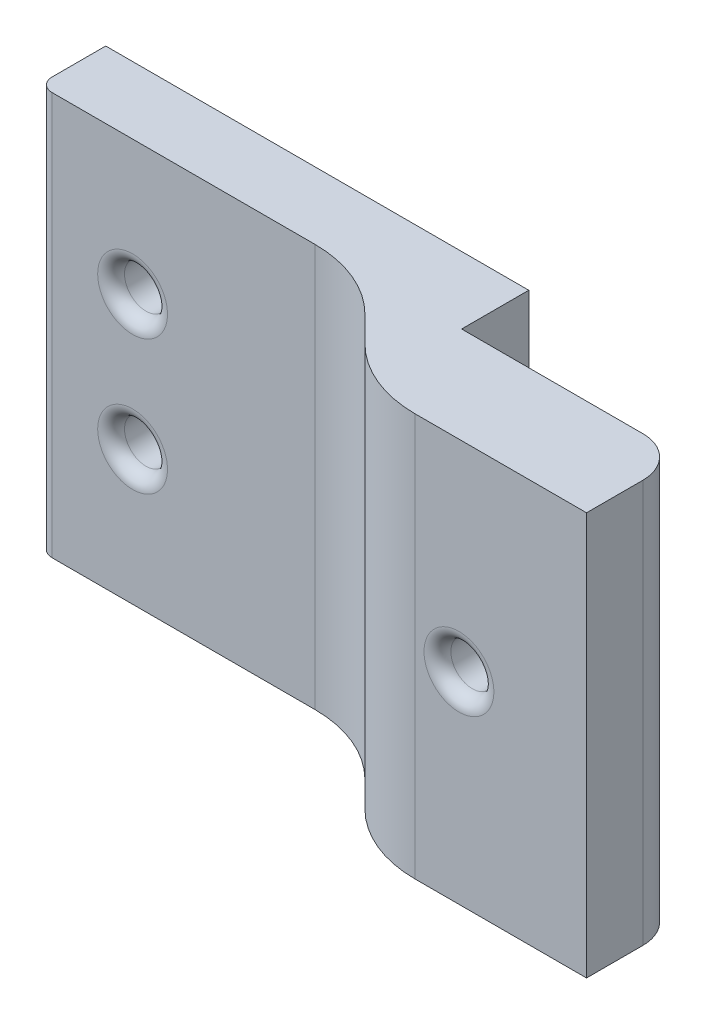
ISO-10303-21;
HEADER;
FILE_DESCRIPTION(('STEP AP214'),'2;1');
FILE_NAME('part.step','',(''),(''),'','','');
FILE_SCHEMA(('AUTOMOTIVE_DESIGN { 1 0 10303 214 1 1 1 1 }'));
ENDSEC;
DATA;
#1=APPLICATION_CONTEXT('core data for automotive mechanical design processes');
#2=APPLICATION_PROTOCOL_DEFINITION('international standard','automotive_design',2000,#1);
#3=PRODUCT_CONTEXT('',#1,'mechanical');
#4=PRODUCT('Part','Part','',(#3));
#5=PRODUCT_RELATED_PRODUCT_CATEGORY('part','',(#4));
#6=PRODUCT_DEFINITION_FORMATION('','',#4);
#7=PRODUCT_DEFINITION_CONTEXT('part definition',#1,'design');
#8=PRODUCT_DEFINITION('design','',#6,#7);
#9=PRODUCT_DEFINITION_SHAPE('','',#8);
#10=(LENGTH_UNIT() NAMED_UNIT(*) SI_UNIT(.MILLI.,.METRE.));
#11=(NAMED_UNIT(*) PLANE_ANGLE_UNIT() SI_UNIT($,.RADIAN.));
#12=(NAMED_UNIT(*) SI_UNIT($,.STERADIAN.) SOLID_ANGLE_UNIT());
#13=UNCERTAINTY_MEASURE_WITH_UNIT(LENGTH_MEASURE(1.E-05),#10,'distance_accuracy_value','');
#14=(GEOMETRIC_REPRESENTATION_CONTEXT(3) GLOBAL_UNCERTAINTY_ASSIGNED_CONTEXT((#13)) GLOBAL_UNIT_ASSIGNED_CONTEXT((#10,
#11,#12)) REPRESENTATION_CONTEXT('',''));
#15=CARTESIAN_POINT('',(0.,0.,0.));
#16=DIRECTION('',(0.,0.,1.));
#17=DIRECTION('',(1.,0.,0.));
#18=AXIS2_PLACEMENT_3D('',#15,#16,#17);
#19=CARTESIAN_POINT('',(10.6210039239997,30.,1.89238691569627));
#20=DIRECTION('',(-1.,0.,0.));
#21=DIRECTION('',(0.,0.,1.));
#22=AXIS2_PLACEMENT_3D('',#19,#20,#21);
#23=PLANE('',#22);
#24=DIRECTION('',(0.,0.,-1.));
#25=VECTOR('',#24,1.);
#26=CARTESIAN_POINT('',(10.6210039239997,0.,1.89238691569627));
#27=LINE('',#26,#25);
#28=CARTESIAN_POINT('',(10.6210039239997,0.,9.09238691569627));
#29=VERTEX_POINT('',#28);
#30=CARTESIAN_POINT('',(10.6210039239997,0.,4.89238691569627));
#31=VERTEX_POINT('',#30);
#32=EDGE_CURVE('E163',#29,#31,#27,.T.);
#33=ORIENTED_EDGE('',*,*,#32,.T.);
#34=DIRECTION('',(0.,-1.,0.));
#35=VECTOR('',#34,1.);
#36=CARTESIAN_POINT('',(10.6210039239997,30.,4.89238691569627));
#37=LINE('',#36,#35);
#38=CARTESIAN_POINT('',(10.6210039239997,30.,4.89238691569627));
#39=VERTEX_POINT('',#38);
#40=EDGE_CURVE('E225',#31,#39,#37,.F.);
#41=ORIENTED_EDGE('',*,*,#40,.T.);
#42=DIRECTION('',(0.,0.,-1.));
#43=VECTOR('',#42,1.);
#44=CARTESIAN_POINT('',(10.6210039239997,30.,1.89238691569627));
#45=LINE('',#44,#43);
#46=CARTESIAN_POINT('',(10.6210039239997,30.,9.09238691569627));
#47=VERTEX_POINT('',#46);
#48=EDGE_CURVE('E133',#47,#39,#45,.T.);
#49=ORIENTED_EDGE('',*,*,#48,.F.);
#50=DIRECTION('',(0.,-1.,0.));
#51=VECTOR('',#50,1.);
#52=CARTESIAN_POINT('',(10.6210039239997,30.,9.09238691569627));
#53=LINE('',#52,#51);
#54=EDGE_CURVE('E162',#47,#29,#53,.T.);
#55=ORIENTED_EDGE('',*,*,#54,.T.);
#56=EDGE_LOOP('',(#33,#41,#49,#55));
#57=FACE_BOUND('',#56,.T.);
#58=ADVANCED_FACE('F33',(#57),#23,.F.);
#59=CARTESIAN_POINT('',(-5.87899607600026,30.,1.89238691569627));
#60=DIRECTION('',(0.,0.,1.));
#61=DIRECTION('',(1.,0.,0.));
#62=AXIS2_PLACEMENT_3D('',#59,#60,#61);
#63=PLANE('',#62);
#64=CARTESIAN_POINT('',(1.12100392399974,15.,1.89238691569627));
#65=DIRECTION('',(0.,0.,1.));
#66=DIRECTION('',(1.,0.,0.));
#67=AXIS2_PLACEMENT_3D('',#64,#65,#66);
#68=CIRCLE('',#67,2.6);
#69=CARTESIAN_POINT('',(3.72100392399974,15.,1.89238691569627));
#70=VERTEX_POINT('',#69);
#71=EDGE_CURVE('E215',#70,#70,#68,.T.);
#72=ORIENTED_EDGE('',*,*,#71,.T.);
#73=EDGE_LOOP('',(#72));
#74=FACE_BOUND('',#73,.T.);
#75=DIRECTION('',(-1.,0.,0.));
#76=VECTOR('',#75,1.);
#77=CARTESIAN_POINT('',(-5.87899607600026,30.,1.89238691569627));
#78=LINE('',#77,#76);
#79=CARTESIAN_POINT('',(7.62100392399974,30.,1.89238691569627));
#80=VERTEX_POINT('',#79);
#81=CARTESIAN_POINT('',(-5.87899607600026,30.,1.89238691569627));
#82=VERTEX_POINT('',#81);
#83=EDGE_CURVE('E121',#80,#82,#78,.T.);
#84=ORIENTED_EDGE('',*,*,#83,.F.);
#85=DIRECTION('',(0.,-1.,0.));
#86=VECTOR('',#85,1.);
#87=CARTESIAN_POINT('',(7.62100392399974,30.,1.89238691569627));
#88=LINE('',#87,#86);
#89=CARTESIAN_POINT('',(7.62100392399974,0.,1.89238691569627));
#90=VERTEX_POINT('',#89);
#91=EDGE_CURVE('E221',#80,#90,#88,.T.);
#92=ORIENTED_EDGE('',*,*,#91,.T.);
#93=DIRECTION('',(-1.,0.,0.));
#94=VECTOR('',#93,1.);
#95=CARTESIAN_POINT('',(-5.87899607600026,0.,1.89238691569627));
#96=LINE('',#95,#94);
#97=CARTESIAN_POINT('',(-5.87899607600026,0.,1.89238691569627));
#98=VERTEX_POINT('',#97);
#99=EDGE_CURVE('E139',#90,#98,#96,.T.);
#100=ORIENTED_EDGE('',*,*,#99,.T.);
#101=DIRECTION('',(0.,-1.,0.));
#102=VECTOR('',#101,1.);
#103=CARTESIAN_POINT('',(-5.87899607600026,30.,1.89238691569627));
#104=LINE('',#103,#102);
#105=EDGE_CURVE('E136',#82,#98,#104,.T.);
#106=ORIENTED_EDGE('',*,*,#105,.F.);
#107=EDGE_LOOP('',(#84,#92,#100,#106));
#108=FACE_BOUND('',#107,.T.);
#109=ADVANCED_FACE('F137',(#74,#108),#63,.F.);
#110=CARTESIAN_POINT('',(-5.87899607600026,30.,-3.10761308430373));
#111=DIRECTION('',(-1.,0.,0.));
#112=DIRECTION('',(0.,0.,1.));
#113=AXIS2_PLACEMENT_3D('',#110,#111,#112);
#114=PLANE('',#113);
#115=DIRECTION('',(0.,0.,-1.));
#116=VECTOR('',#115,1.);
#117=CARTESIAN_POINT('',(-5.87899607600026,0.,-3.10761308430373));
#118=LINE('',#117,#116);
#119=CARTESIAN_POINT('',(-5.87899607600026,0.,-3.10761308430373));
#120=VERTEX_POINT('',#119);
#121=EDGE_CURVE('E167',#98,#120,#118,.T.);
#122=ORIENTED_EDGE('',*,*,#121,.T.);
#123=DIRECTION('',(0.,-1.,0.));
#124=VECTOR('',#123,1.);
#125=CARTESIAN_POINT('',(-5.87899607600026,30.,-3.10761308430373));
#126=LINE('',#125,#124);
#127=CARTESIAN_POINT('',(-5.87899607600026,30.,-3.10761308430373));
#128=VERTEX_POINT('',#127);
#129=EDGE_CURVE('E143',#128,#120,#126,.T.);
#130=ORIENTED_EDGE('',*,*,#129,.F.);
#131=DIRECTION('',(0.,0.,-1.));
#132=VECTOR('',#131,1.);
#133=CARTESIAN_POINT('',(-5.87899607600026,30.,-3.10761308430373));
#134=LINE('',#133,#132);
#135=EDGE_CURVE('E125',#82,#128,#134,.T.);
#136=ORIENTED_EDGE('',*,*,#135,.F.);
#137=ORIENTED_EDGE('',*,*,#105,.T.);
#138=EDGE_LOOP('',(#122,#130,#136,#137));
#139=FACE_BOUND('',#138,.T.);
#140=ADVANCED_FACE('F145',(#139),#114,.F.);
#141=CARTESIAN_POINT('',(-5.87899607600026,30.,-3.10761308430373));
#142=DIRECTION('',(0.,0.,1.));
#143=DIRECTION('',(1.,0.,0.));
#144=AXIS2_PLACEMENT_3D('',#141,#142,#143);
#145=PLANE('',#144);
#146=CARTESIAN_POINT('',(-30.3789960760003,10.,-3.10761308430373));
#147=DIRECTION('',(0.,0.,1.));
#148=DIRECTION('',(1.,0.,0.));
#149=AXIS2_PLACEMENT_3D('',#146,#147,#148);
#150=CIRCLE('',#149,2.6);
#151=CARTESIAN_POINT('',(-27.7789960760003,10.,-3.10761308430373));
#152=VERTEX_POINT('',#151);
#153=EDGE_CURVE('E200',#152,#152,#150,.T.);
#154=ORIENTED_EDGE('',*,*,#153,.T.);
#155=EDGE_LOOP('',(#154));
#156=FACE_BOUND('',#155,.T.);
#157=CARTESIAN_POINT('',(-30.3789960760003,20.,-3.10761308430373));
#158=DIRECTION('',(0.,0.,1.));
#159=DIRECTION('',(1.,0.,0.));
#160=AXIS2_PLACEMENT_3D('',#157,#158,#159);
#161=CIRCLE('',#160,2.6);
#162=CARTESIAN_POINT('',(-27.7789960760003,20.,-3.10761308430373));
#163=VERTEX_POINT('',#162);
#164=EDGE_CURVE('E197',#163,#163,#161,.T.);
#165=ORIENTED_EDGE('',*,*,#164,.T.);
#166=EDGE_LOOP('',(#165));
#167=FACE_BOUND('',#166,.T.);
#168=DIRECTION('',(-1.,0.,0.));
#169=VECTOR('',#168,1.);
#170=CARTESIAN_POINT('',(-5.87899607600026,0.,-3.10761308430373));
#171=LINE('',#170,#169);
#172=CARTESIAN_POINT('',(-37.3789960760003,0.,-3.10761308430373));
#173=VERTEX_POINT('',#172);
#174=EDGE_CURVE('E169',#120,#173,#171,.T.);
#175=ORIENTED_EDGE('',*,*,#174,.T.);
#176=DIRECTION('',(0.,-1.,0.));
#177=VECTOR('',#176,1.);
#178=CARTESIAN_POINT('',(-37.3789960760003,30.,-3.10761308430373));
#179=LINE('',#178,#177);
#180=CARTESIAN_POINT('',(-37.3789960760003,30.,-3.10761308430373));
#181=VERTEX_POINT('',#180);
#182=EDGE_CURVE('E182',#181,#173,#179,.T.);
#183=ORIENTED_EDGE('',*,*,#182,.F.);
#184=DIRECTION('',(-1.,0.,0.));
#185=VECTOR('',#184,1.);
#186=CARTESIAN_POINT('',(-5.87899607600026,30.,-3.10761308430373));
#187=LINE('',#186,#185);
#188=EDGE_CURVE('E148',#128,#181,#187,.T.);
#189=ORIENTED_EDGE('',*,*,#188,.F.);
#190=ORIENTED_EDGE('',*,*,#129,.T.);
#191=EDGE_LOOP('',(#175,#183,#189,#190));
#192=FACE_BOUND('',#191,.T.);
#193=ADVANCED_FACE('F285',(#156,#167,#192),#145,.F.);
#194=CARTESIAN_POINT('',(-37.3789960760003,30.,1.89238691569627));
#195=DIRECTION('',(1.,0.,0.));
#196=DIRECTION('',(0.,0.,-1.));
#197=AXIS2_PLACEMENT_3D('',#194,#195,#196);
#198=PLANE('',#197);
#199=DIRECTION('',(0.,0.,1.));
#200=VECTOR('',#199,1.);
#201=CARTESIAN_POINT('',(-37.3789960760003,0.,1.89238691569627));
#202=LINE('',#201,#200);
#203=CARTESIAN_POINT('',(-37.3789960760003,0.,0.892386915696272));
#204=VERTEX_POINT('',#203);
#205=EDGE_CURVE('E171',#173,#204,#202,.T.);
#206=ORIENTED_EDGE('',*,*,#205,.T.);
#207=DIRECTION('',(0.,-1.,0.));
#208=VECTOR('',#207,1.);
#209=CARTESIAN_POINT('',(-37.3789960760003,30.,0.892386915696272));
#210=LINE('',#209,#208);
#211=CARTESIAN_POINT('',(-37.3789960760003,30.,0.892386915696272));
#212=VERTEX_POINT('',#211);
#213=EDGE_CURVE('E41',#204,#212,#210,.F.);
#214=ORIENTED_EDGE('',*,*,#213,.T.);
#215=DIRECTION('',(0.,0.,1.));
#216=VECTOR('',#215,1.);
#217=CARTESIAN_POINT('',(-37.3789960760003,30.,1.89238691569627));
#218=LINE('',#217,#216);
#219=EDGE_CURVE('E150',#181,#212,#218,.T.);
#220=ORIENTED_EDGE('',*,*,#219,.F.);
#221=ORIENTED_EDGE('',*,*,#182,.T.);
#222=EDGE_LOOP('',(#206,#214,#220,#221));
#223=FACE_BOUND('',#222,.T.);
#224=ADVANCED_FACE('F343',(#223),#198,.F.);
#225=CARTESIAN_POINT('',(-37.3789960760003,30.,1.89238691569627));
#226=DIRECTION('',(0.,0.,-1.));
#227=DIRECTION('',(-1.,0.,0.));
#228=AXIS2_PLACEMENT_3D('',#225,#226,#227);
#229=PLANE('',#228);
#230=CARTESIAN_POINT('',(-30.3789960760003,10.,1.89238691569627));
#231=DIRECTION('',(0.,0.,-1.));
#232=DIRECTION('',(-1.,0.,0.));
#233=AXIS2_PLACEMENT_3D('',#230,#231,#232);
#234=CIRCLE('',#233,2.6);
#235=CARTESIAN_POINT('',(-32.9789960760003,10.,1.89238691569627));
#236=VERTEX_POINT('',#235);
#237=EDGE_CURVE('E194',#236,#236,#234,.T.);
#238=ORIENTED_EDGE('',*,*,#237,.T.);
#239=EDGE_LOOP('',(#238));
#240=FACE_BOUND('',#239,.T.);
#241=CARTESIAN_POINT('',(-30.3789960760003,20.,1.89238691569627));
#242=DIRECTION('',(0.,0.,-1.));
#243=DIRECTION('',(-1.,0.,0.));
#244=AXIS2_PLACEMENT_3D('',#241,#242,#243);
#245=CIRCLE('',#244,2.6);
#246=CARTESIAN_POINT('',(-32.9789960760003,20.,1.89238691569627));
#247=VERTEX_POINT('',#246);
#248=EDGE_CURVE('E191',#247,#247,#245,.T.);
#249=ORIENTED_EDGE('',*,*,#248,.T.);
#250=EDGE_LOOP('',(#249));
#251=FACE_BOUND('',#250,.T.);
#252=DIRECTION('',(1.,0.,0.));
#253=VECTOR('',#252,1.);
#254=CARTESIAN_POINT('',(-37.3789960760003,30.,1.89238691569627));
#255=LINE('',#254,#253);
#256=CARTESIAN_POINT('',(-36.3789960760003,30.,1.89238691569627));
#257=VERTEX_POINT('',#256);
#258=CARTESIAN_POINT('',(-16.8069181373582,30.,1.89238691569627));
#259=VERTEX_POINT('',#258);
#260=EDGE_CURVE('E155',#257,#259,#255,.T.);
#261=ORIENTED_EDGE('',*,*,#260,.F.);
#262=DIRECTION('',(0.,-1.,0.));
#263=VECTOR('',#262,1.);
#264=CARTESIAN_POINT('',(-36.3789960760003,30.,1.89238691569627));
#265=LINE('',#264,#263);
#266=CARTESIAN_POINT('',(-36.3789960760003,0.,1.89238691569627));
#267=VERTEX_POINT('',#266);
#268=EDGE_CURVE('E248',#257,#267,#265,.T.);
#269=ORIENTED_EDGE('',*,*,#268,.T.);
#270=DIRECTION('',(1.,0.,0.));
#271=VECTOR('',#270,1.);
#272=CARTESIAN_POINT('',(-37.3789960760003,0.,1.89238691569627));
#273=LINE('',#272,#271);
#274=CARTESIAN_POINT('',(-16.8069181373582,0.,1.89238691569627));
#275=VERTEX_POINT('',#274);
#276=EDGE_CURVE('E173',#267,#275,#273,.T.);
#277=ORIENTED_EDGE('',*,*,#276,.T.);
#278=DIRECTION('',(0.,-1.,0.));
#279=VECTOR('',#278,1.);
#280=CARTESIAN_POINT('',(-16.8069181373582,30.,1.89238691569627));
#281=LINE('',#280,#279);
#282=EDGE_CURVE('E233',#275,#259,#281,.F.);
#283=ORIENTED_EDGE('',*,*,#282,.T.);
#284=EDGE_LOOP('',(#261,#269,#277,#283));
#285=FACE_BOUND('',#284,.T.);
#286=ADVANCED_FACE('F254',(#240,#251,#285),#229,.F.);
#287=CARTESIAN_POINT('',(-5.87899607600026,30.,9.09238691569627));
#288=DIRECTION('',(0.707106781186544,0.,-0.707106781186551));
#289=DIRECTION('',(-0.707106781186551,0.,-0.707106781186544));
#290=AXIS2_PLACEMENT_3D('',#287,#288,#289);
#291=PLANE('',#290);
#292=DIRECTION('',(0.707106781186551,0.,0.707106781186544));
#293=VECTOR('',#292,1.);
#294=CARTESIAN_POINT('',(-5.87899607600026,30.,9.09238691569627));
#295=LINE('',#294,#293);
#296=CARTESIAN_POINT('',(-10.4429571066793,30.,4.52842588501731));
#297=VERTEX_POINT('',#296);
#298=CARTESIAN_POINT('',(-8.51503504532132,30.,6.45634794637523));
#299=VERTEX_POINT('',#298);
#300=EDGE_CURVE('E157',#297,#299,#295,.T.);
#301=ORIENTED_EDGE('',*,*,#300,.F.);
#302=DIRECTION('',(0.,-1.,0.));
#303=VECTOR('',#302,1.);
#304=CARTESIAN_POINT('',(-10.4429571066793,0.,4.52842588501731));
#305=LINE('',#304,#303);
#306=CARTESIAN_POINT('',(-10.4429571066793,0.,4.52842588501731));
#307=VERTEX_POINT('',#306);
#308=EDGE_CURVE('E230',#297,#307,#305,.T.);
#309=ORIENTED_EDGE('',*,*,#308,.T.);
#310=DIRECTION('',(0.707106781186551,0.,0.707106781186544));
#311=VECTOR('',#310,1.);
#312=CARTESIAN_POINT('',(-5.87899607600026,0.,9.09238691569627));
#313=LINE('',#312,#311);
#314=CARTESIAN_POINT('',(-8.51503504532132,0.,6.45634794637523));
#315=VERTEX_POINT('',#314);
#316=EDGE_CURVE('E175',#307,#315,#313,.T.);
#317=ORIENTED_EDGE('',*,*,#316,.T.);
#318=DIRECTION('',(0.,-1.,0.));
#319=VECTOR('',#318,1.);
#320=CARTESIAN_POINT('',(-8.51503504532132,30.,6.45634794637523));
#321=LINE('',#320,#319);
#322=EDGE_CURVE('E228',#315,#299,#321,.F.);
#323=ORIENTED_EDGE('',*,*,#322,.T.);
#324=EDGE_LOOP('',(#301,#309,#317,#323));
#325=FACE_BOUND('',#324,.T.);
#326=ADVANCED_FACE('F267',(#325),#291,.F.);
#327=CARTESIAN_POINT('',(-5.87899607600026,30.,9.09238691569627));
#328=DIRECTION('',(0.,0.,-1.));
#329=DIRECTION('',(-1.,0.,0.));
#330=AXIS2_PLACEMENT_3D('',#327,#328,#329);
#331=PLANE('',#330);
#332=CARTESIAN_POINT('',(1.12100392399974,15.,9.09238691569627));
#333=DIRECTION('',(0.,0.,-1.));
#334=DIRECTION('',(-1.,0.,0.));
#335=AXIS2_PLACEMENT_3D('',#332,#333,#334);
#336=CIRCLE('',#335,2.6);
#337=CARTESIAN_POINT('',(-1.47899607600026,15.,9.09238691569627));
#338=VERTEX_POINT('',#337);
#339=EDGE_CURVE('E218',#338,#338,#336,.T.);
#340=ORIENTED_EDGE('',*,*,#339,.T.);
#341=EDGE_LOOP('',(#340));
#342=FACE_BOUND('',#341,.T.);
#343=DIRECTION('',(1.,0.,0.));
#344=VECTOR('',#343,1.);
#345=CARTESIAN_POINT('',(-5.87899607600026,30.,9.09238691569627));
#346=LINE('',#345,#344);
#347=CARTESIAN_POINT('',(-2.15107401464243,30.,9.09238691569627));
#348=VERTEX_POINT('',#347);
#349=EDGE_CURVE('E160',#348,#47,#346,.T.);
#350=ORIENTED_EDGE('',*,*,#349,.F.);
#351=DIRECTION('',(0.,-1.,0.));
#352=VECTOR('',#351,1.);
#353=CARTESIAN_POINT('',(-2.15107401464243,30.,9.09238691569627));
#354=LINE('',#353,#352);
#355=CARTESIAN_POINT('',(-2.15107401464243,0.,9.09238691569627));
#356=VERTEX_POINT('',#355);
#357=EDGE_CURVE('E236',#348,#356,#354,.T.);
#358=ORIENTED_EDGE('',*,*,#357,.T.);
#359=DIRECTION('',(1.,0.,0.));
#360=VECTOR('',#359,1.);
#361=CARTESIAN_POINT('',(-5.87899607600026,0.,9.09238691569627));
#362=LINE('',#361,#360);
#363=EDGE_CURVE('E178',#356,#29,#362,.T.);
#364=ORIENTED_EDGE('',*,*,#363,.T.);
#365=ORIENTED_EDGE('',*,*,#54,.F.);
#366=EDGE_LOOP('',(#350,#358,#364,#365));
#367=FACE_BOUND('',#366,.T.);
#368=ADVANCED_FACE('F275',(#342,#367),#331,.F.);
#369=CARTESIAN_POINT('',(0.,30.,0.));
#370=DIRECTION('',(0.,1.,0.));
#371=DIRECTION('',(0.,0.,1.));
#372=AXIS2_PLACEMENT_3D('',#369,#370,#371);
#373=PLANE('',#372);
#374=ORIENTED_EDGE('',*,*,#219,.T.);
#375=CARTESIAN_POINT('',(-36.3789960760003,30.,0.892386915696272));
#376=DIRECTION('',(0.,1.,0.));
#377=DIRECTION('',(0.,0.,1.));
#378=AXIS2_PLACEMENT_3D('',#375,#376,#377);
#379=CIRCLE('',#378,1.);
#380=EDGE_CURVE('E11',#212,#257,#379,.T.);
#381=ORIENTED_EDGE('',*,*,#380,.T.);
#382=ORIENTED_EDGE('',*,*,#260,.T.);
#383=CARTESIAN_POINT('',(-16.8069181373582,30.,10.8923869156963));
#384=DIRECTION('',(0.,1.,0.));
#385=DIRECTION('',(0.,0.,1.));
#386=AXIS2_PLACEMENT_3D('',#383,#384,#385);
#387=CIRCLE('',#386,9.);
#388=EDGE_CURVE('E246',#259,#297,#387,.F.);
#389=ORIENTED_EDGE('',*,*,#388,.T.);
#390=ORIENTED_EDGE('',*,*,#300,.T.);
#391=CARTESIAN_POINT('',(-2.15107401464243,30.,0.0923869156962721));
#392=DIRECTION('',(0.,1.,0.));
#393=DIRECTION('',(0.,0.,1.));
#394=AXIS2_PLACEMENT_3D('',#391,#392,#393);
#395=CIRCLE('',#394,9.);
#396=EDGE_CURVE('E241',#299,#348,#395,.T.);
#397=ORIENTED_EDGE('',*,*,#396,.T.);
#398=ORIENTED_EDGE('',*,*,#349,.T.);
#399=ORIENTED_EDGE('',*,*,#48,.T.);
#400=CARTESIAN_POINT('',(7.62100392399974,30.,4.89238691569627));
#401=DIRECTION('',(0.,1.,0.));
#402=DIRECTION('',(0.,0.,1.));
#403=AXIS2_PLACEMENT_3D('',#400,#401,#402);
#404=CIRCLE('',#403,3.);
#405=EDGE_CURVE('E129',#39,#80,#404,.T.);
#406=ORIENTED_EDGE('',*,*,#405,.T.);
#407=ORIENTED_EDGE('',*,*,#83,.T.);
#408=ORIENTED_EDGE('',*,*,#135,.T.);
#409=ORIENTED_EDGE('',*,*,#188,.T.);
#410=EDGE_LOOP('',(#374,#381,#382,#389,#390,#397,#398,#399,#406,#407,#408,#409));
#411=FACE_BOUND('',#410,.T.);
#412=ADVANCED_FACE('F123',(#411),#373,.T.);
#413=CARTESIAN_POINT('',(0.,0.,0.));
#414=DIRECTION('',(0.,1.,0.));
#415=DIRECTION('',(0.,0.,1.));
#416=AXIS2_PLACEMENT_3D('',#413,#414,#415);
#417=PLANE('',#416);
#418=ORIENTED_EDGE('',*,*,#276,.F.);
#419=CARTESIAN_POINT('',(-36.3789960760003,0.,0.892386915696272));
#420=DIRECTION('',(0.,1.,0.));
#421=DIRECTION('',(0.,0.,1.));
#422=AXIS2_PLACEMENT_3D('',#419,#420,#421);
#423=CIRCLE('',#422,1.);
#424=EDGE_CURVE('E55',#267,#204,#423,.F.);
#425=ORIENTED_EDGE('',*,*,#424,.T.);
#426=ORIENTED_EDGE('',*,*,#205,.F.);
#427=ORIENTED_EDGE('',*,*,#174,.F.);
#428=ORIENTED_EDGE('',*,*,#121,.F.);
#429=ORIENTED_EDGE('',*,*,#99,.F.);
#430=CARTESIAN_POINT('',(7.62100392399974,0.,4.89238691569627));
#431=DIRECTION('',(0.,1.,0.));
#432=DIRECTION('',(0.,0.,1.));
#433=AXIS2_PLACEMENT_3D('',#430,#431,#432);
#434=CIRCLE('',#433,3.);
#435=EDGE_CURVE('E223',#90,#31,#434,.F.);
#436=ORIENTED_EDGE('',*,*,#435,.T.);
#437=ORIENTED_EDGE('',*,*,#32,.F.);
#438=ORIENTED_EDGE('',*,*,#363,.F.);
#439=CARTESIAN_POINT('',(-2.15107401464243,0.,0.0923869156962721));
#440=DIRECTION('',(0.,1.,0.));
#441=DIRECTION('',(0.,0.,1.));
#442=AXIS2_PLACEMENT_3D('',#439,#440,#441);
#443=CIRCLE('',#442,9.);
#444=EDGE_CURVE('E239',#356,#315,#443,.F.);
#445=ORIENTED_EDGE('',*,*,#444,.T.);
#446=ORIENTED_EDGE('',*,*,#316,.F.);
#447=CARTESIAN_POINT('',(-16.8069181373582,0.,10.8923869156963));
#448=DIRECTION('',(0.,1.,0.));
#449=DIRECTION('',(0.,0.,1.));
#450=AXIS2_PLACEMENT_3D('',#447,#448,#449);
#451=CIRCLE('',#450,9.);
#452=EDGE_CURVE('E243',#307,#275,#451,.T.);
#453=ORIENTED_EDGE('',*,*,#452,.T.);
#454=EDGE_LOOP('',(#418,#425,#426,#427,#428,#429,#436,#437,#438,#445,#446,#453));
#455=FACE_BOUND('',#454,.T.);
#456=ADVANCED_FACE('F257',(#455),#417,.F.);
#457=CARTESIAN_POINT('',(1.12100392399974,15.,-2.63309648389763));
#458=DIRECTION('',(0.,0.,1.));
#459=DIRECTION('',(1.,0.,0.));
#460=AXIS2_PLACEMENT_3D('',#457,#458,#459);
#461=CYLINDRICAL_SURFACE('',#460,1.6);
#462=CARTESIAN_POINT('',(1.12100392399974,15.,2.89238691569627));
#463=DIRECTION('',(0.,0.,1.));
#464=DIRECTION('',(1.,0.,0.));
#465=AXIS2_PLACEMENT_3D('',#462,#463,#464);
#466=CIRCLE('',#465,1.6);
#467=CARTESIAN_POINT('',(2.72100392399974,15.,2.89238691569627));
#468=VERTEX_POINT('',#467);
#469=EDGE_CURVE('E212',#468,#468,#466,.F.);
#470=ORIENTED_EDGE('',*,*,#469,.T.);
#471=EDGE_LOOP('',(#470));
#472=FACE_BOUND('',#471,.T.);
#473=CARTESIAN_POINT('',(1.12100392399974,15.,8.09238691569627));
#474=DIRECTION('',(0.,0.,-1.));
#475=DIRECTION('',(-1.,0.,0.));
#476=AXIS2_PLACEMENT_3D('',#473,#474,#475);
#477=CIRCLE('',#476,1.6);
#478=CARTESIAN_POINT('',(-0.478996076000256,15.,8.09238691569627));
#479=VERTEX_POINT('',#478);
#480=EDGE_CURVE('E209',#479,#479,#477,.F.);
#481=ORIENTED_EDGE('',*,*,#480,.T.);
#482=EDGE_LOOP('',(#481));
#483=FACE_BOUND('',#482,.T.);
#484=ADVANCED_FACE('F378',(#472,#483),#461,.F.);
#485=CARTESIAN_POINT('',(-30.3789960760003,20.,-7.63309648389763));
#486=DIRECTION('',(0.,0.,1.));
#487=DIRECTION('',(1.,0.,0.));
#488=AXIS2_PLACEMENT_3D('',#485,#486,#487);
#489=CYLINDRICAL_SURFACE('',#488,1.6);
#490=CARTESIAN_POINT('',(-30.3789960760003,20.,-2.10761308430373));
#491=DIRECTION('',(0.,0.,1.));
#492=DIRECTION('',(1.,0.,0.));
#493=AXIS2_PLACEMENT_3D('',#490,#491,#492);
#494=CIRCLE('',#493,1.6);
#495=CARTESIAN_POINT('',(-28.7789960760003,20.,-2.10761308430373));
#496=VERTEX_POINT('',#495);
#497=EDGE_CURVE('E206',#496,#496,#494,.F.);
#498=ORIENTED_EDGE('',*,*,#497,.T.);
#499=EDGE_LOOP('',(#498));
#500=FACE_BOUND('',#499,.T.);
#501=CARTESIAN_POINT('',(-30.3789960760003,20.,0.892386915696272));
#502=DIRECTION('',(0.,0.,-1.));
#503=DIRECTION('',(-1.,0.,0.));
#504=AXIS2_PLACEMENT_3D('',#501,#502,#503);
#505=CIRCLE('',#504,1.6);
#506=CARTESIAN_POINT('',(-31.9789960760003,20.,0.892386915696272));
#507=VERTEX_POINT('',#506);
#508=EDGE_CURVE('E203',#507,#507,#505,.F.);
#509=ORIENTED_EDGE('',*,*,#508,.T.);
#510=EDGE_LOOP('',(#509));
#511=FACE_BOUND('',#510,.T.);
#512=ADVANCED_FACE('F391',(#500,#511),#489,.F.);
#513=CARTESIAN_POINT('',(-30.3789960760003,10.,-7.63309648389763));
#514=DIRECTION('',(0.,0.,1.));
#515=DIRECTION('',(1.,0.,0.));
#516=AXIS2_PLACEMENT_3D('',#513,#514,#515);
#517=CYLINDRICAL_SURFACE('',#516,1.6);
#518=CARTESIAN_POINT('',(-30.3789960760003,10.,0.892386915696272));
#519=DIRECTION('',(0.,0.,-1.));
#520=DIRECTION('',(-1.,0.,0.));
#521=AXIS2_PLACEMENT_3D('',#518,#519,#520);
#522=CIRCLE('',#521,1.6);
#523=CARTESIAN_POINT('',(-31.9789960760003,10.,0.892386915696272));
#524=VERTEX_POINT('',#523);
#525=EDGE_CURVE('E188',#524,#524,#522,.F.);
#526=ORIENTED_EDGE('',*,*,#525,.T.);
#527=EDGE_LOOP('',(#526));
#528=FACE_BOUND('',#527,.T.);
#529=CARTESIAN_POINT('',(-30.3789960760003,10.,-2.10761308430373));
#530=DIRECTION('',(0.,0.,1.));
#531=DIRECTION('',(1.,0.,0.));
#532=AXIS2_PLACEMENT_3D('',#529,#530,#531);
#533=CIRCLE('',#532,1.6);
#534=CARTESIAN_POINT('',(-28.7789960760003,10.,-2.10761308430373));
#535=VERTEX_POINT('',#534);
#536=EDGE_CURVE('E142',#535,#535,#533,.F.);
#537=ORIENTED_EDGE('',*,*,#536,.T.);
#538=EDGE_LOOP('',(#537));
#539=FACE_BOUND('',#538,.T.);
#540=ADVANCED_FACE('F304',(#528,#539),#517,.F.);
#541=CARTESIAN_POINT('',(-30.3789960760003,10.,0.892386915696272));
#542=DIRECTION('',(0.,0.,-1.));
#543=DIRECTION('',(-1.,0.,0.));
#544=AXIS2_PLACEMENT_3D('',#541,#542,#543);
#545=TOROIDAL_SURFACE('',#544,2.6,1.);
#546=ORIENTED_EDGE('',*,*,#237,.F.);
#547=EDGE_LOOP('',(#546));
#548=FACE_BOUND('',#547,.T.);
#549=ORIENTED_EDGE('',*,*,#525,.F.);
#550=EDGE_LOOP('',(#549));
#551=FACE_BOUND('',#550,.T.);
#552=ADVANCED_FACE('F300',(#548,#551),#545,.T.);
#553=CARTESIAN_POINT('',(-30.3789960760003,10.,-2.10761308430373));
#554=DIRECTION('',(0.,0.,1.));
#555=DIRECTION('',(1.,0.,0.));
#556=AXIS2_PLACEMENT_3D('',#553,#554,#555);
#557=TOROIDAL_SURFACE('',#556,2.6,1.);
#558=ORIENTED_EDGE('',*,*,#153,.F.);
#559=EDGE_LOOP('',(#558));
#560=FACE_BOUND('',#559,.T.);
#561=ORIENTED_EDGE('',*,*,#536,.F.);
#562=EDGE_LOOP('',(#561));
#563=FACE_BOUND('',#562,.T.);
#564=ADVANCED_FACE('F303',(#560,#563),#557,.T.);
#565=CARTESIAN_POINT('',(-30.3789960760003,20.,-2.10761308430373));
#566=DIRECTION('',(0.,0.,1.));
#567=DIRECTION('',(1.,0.,0.));
#568=AXIS2_PLACEMENT_3D('',#565,#566,#567);
#569=TOROIDAL_SURFACE('',#568,2.6,1.);
#570=ORIENTED_EDGE('',*,*,#164,.F.);
#571=EDGE_LOOP('',(#570));
#572=FACE_BOUND('',#571,.T.);
#573=ORIENTED_EDGE('',*,*,#497,.F.);
#574=EDGE_LOOP('',(#573));
#575=FACE_BOUND('',#574,.T.);
#576=ADVANCED_FACE('F308',(#572,#575),#569,.T.);
#577=CARTESIAN_POINT('',(1.12100392399974,15.,2.89238691569627));
#578=DIRECTION('',(0.,0.,1.));
#579=DIRECTION('',(1.,0.,0.));
#580=AXIS2_PLACEMENT_3D('',#577,#578,#579);
#581=TOROIDAL_SURFACE('',#580,2.6,1.);
#582=ORIENTED_EDGE('',*,*,#71,.F.);
#583=EDGE_LOOP('',(#582));
#584=FACE_BOUND('',#583,.T.);
#585=ORIENTED_EDGE('',*,*,#469,.F.);
#586=EDGE_LOOP('',(#585));
#587=FACE_BOUND('',#586,.T.);
#588=ADVANCED_FACE('F312',(#584,#587),#581,.T.);
#589=CARTESIAN_POINT('',(1.12100392399974,15.,8.09238691569627));
#590=DIRECTION('',(0.,0.,-1.));
#591=DIRECTION('',(-1.,0.,0.));
#592=AXIS2_PLACEMENT_3D('',#589,#590,#591);
#593=TOROIDAL_SURFACE('',#592,2.6,1.);
#594=ORIENTED_EDGE('',*,*,#339,.F.);
#595=EDGE_LOOP('',(#594));
#596=FACE_BOUND('',#595,.T.);
#597=ORIENTED_EDGE('',*,*,#480,.F.);
#598=EDGE_LOOP('',(#597));
#599=FACE_BOUND('',#598,.T.);
#600=ADVANCED_FACE('F316',(#596,#599),#593,.T.);
#601=CARTESIAN_POINT('',(-30.3789960760003,20.,0.892386915696272));
#602=DIRECTION('',(0.,0.,-1.));
#603=DIRECTION('',(-1.,0.,0.));
#604=AXIS2_PLACEMENT_3D('',#601,#602,#603);
#605=TOROIDAL_SURFACE('',#604,2.6,1.);
#606=ORIENTED_EDGE('',*,*,#248,.F.);
#607=EDGE_LOOP('',(#606));
#608=FACE_BOUND('',#607,.T.);
#609=ORIENTED_EDGE('',*,*,#508,.F.);
#610=EDGE_LOOP('',(#609));
#611=FACE_BOUND('',#610,.T.);
#612=ADVANCED_FACE('F320',(#608,#611),#605,.T.);
#613=CARTESIAN_POINT('',(7.62100392399974,30.,4.89238691569627));
#614=DIRECTION('',(0.,-1.,0.));
#615=DIRECTION('',(0.,0.,-1.));
#616=AXIS2_PLACEMENT_3D('',#613,#614,#615);
#617=CYLINDRICAL_SURFACE('',#616,3.);
#618=ORIENTED_EDGE('',*,*,#405,.F.);
#619=ORIENTED_EDGE('',*,*,#40,.F.);
#620=ORIENTED_EDGE('',*,*,#435,.F.);
#621=ORIENTED_EDGE('',*,*,#91,.F.);
#622=EDGE_LOOP('',(#618,#619,#620,#621));
#623=FACE_BOUND('',#622,.T.);
#624=ADVANCED_FACE('F282',(#623),#617,.T.);
#625=CARTESIAN_POINT('',(-16.8069181373582,30.,10.8923869156963));
#626=DIRECTION('',(0.,1.,0.));
#627=DIRECTION('',(0.,0.,1.));
#628=AXIS2_PLACEMENT_3D('',#625,#626,#627);
#629=CYLINDRICAL_SURFACE('',#628,9.);
#630=ORIENTED_EDGE('',*,*,#388,.F.);
#631=ORIENTED_EDGE('',*,*,#282,.F.);
#632=ORIENTED_EDGE('',*,*,#452,.F.);
#633=ORIENTED_EDGE('',*,*,#308,.F.);
#634=EDGE_LOOP('',(#630,#631,#632,#633));
#635=FACE_BOUND('',#634,.T.);
#636=ADVANCED_FACE('F263',(#635),#629,.F.);
#637=CARTESIAN_POINT('',(-2.15107401464243,30.,0.0923869156962721));
#638=DIRECTION('',(0.,-1.,0.));
#639=DIRECTION('',(0.,0.,-1.));
#640=AXIS2_PLACEMENT_3D('',#637,#638,#639);
#641=CYLINDRICAL_SURFACE('',#640,9.);
#642=ORIENTED_EDGE('',*,*,#396,.F.);
#643=ORIENTED_EDGE('',*,*,#322,.F.);
#644=ORIENTED_EDGE('',*,*,#444,.F.);
#645=ORIENTED_EDGE('',*,*,#357,.F.);
#646=EDGE_LOOP('',(#642,#643,#644,#645));
#647=FACE_BOUND('',#646,.T.);
#648=ADVANCED_FACE('F270',(#647),#641,.T.);
#649=CARTESIAN_POINT('',(-36.3789960760003,30.,0.892386915696272));
#650=DIRECTION('',(0.,-1.,0.));
#651=DIRECTION('',(0.,0.,-1.));
#652=AXIS2_PLACEMENT_3D('',#649,#650,#651);
#653=CYLINDRICAL_SURFACE('',#652,1.);
#654=ORIENTED_EDGE('',*,*,#380,.F.);
#655=ORIENTED_EDGE('',*,*,#213,.F.);
#656=ORIENTED_EDGE('',*,*,#424,.F.);
#657=ORIENTED_EDGE('',*,*,#268,.F.);
#658=EDGE_LOOP('',(#654,#655,#656,#657));
#659=FACE_BOUND('',#658,.T.);
#660=ADVANCED_FACE('F35',(#659),#653,.T.);
#661=CLOSED_SHELL('',(#58,#109,#140,#193,#224,#286,#326,#368,#412,#456,#484,#512,#540,#552,#564,
#576,#588,#600,#612,#624,#636,#648,#660));
#662=MANIFOLD_SOLID_BREP('B2',#661);
#663=ADVANCED_BREP_SHAPE_REPRESENTATION('',(#18,#662),#14);
#664=SHAPE_DEFINITION_REPRESENTATION(#9,#663);
ENDSEC;
END-ISO-10303-21;
